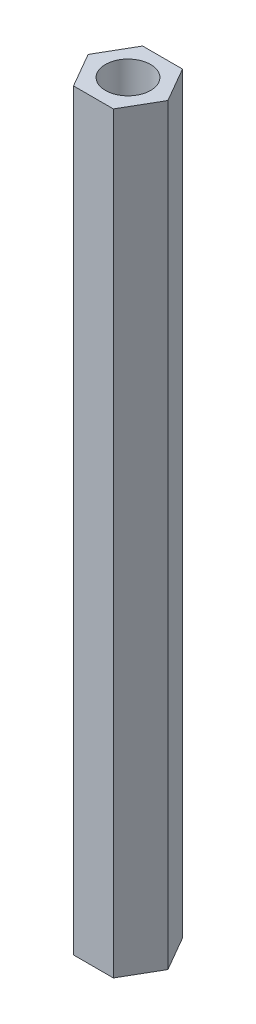
ISO-10303-21;
HEADER;
FILE_DESCRIPTION(('STEP AP214'),'2;1');
FILE_NAME('part.step','',(''),(''),'','','');
FILE_SCHEMA(('AUTOMOTIVE_DESIGN { 1 0 10303 214 1 1 1 1 }'));
ENDSEC;
DATA;
#1=APPLICATION_CONTEXT('core data for automotive mechanical design processes');
#2=APPLICATION_PROTOCOL_DEFINITION('international standard','automotive_design',2000,#1);
#3=PRODUCT_CONTEXT('',#1,'mechanical');
#4=PRODUCT('Part','Part','',(#3));
#5=PRODUCT_RELATED_PRODUCT_CATEGORY('part','',(#4));
#6=PRODUCT_DEFINITION_FORMATION('','',#4);
#7=PRODUCT_DEFINITION_CONTEXT('part definition',#1,'design');
#8=PRODUCT_DEFINITION('design','',#6,#7);
#9=PRODUCT_DEFINITION_SHAPE('','',#8);
#10=(LENGTH_UNIT() NAMED_UNIT(*) SI_UNIT(.MILLI.,.METRE.));
#11=(NAMED_UNIT(*) PLANE_ANGLE_UNIT() SI_UNIT($,.RADIAN.));
#12=(NAMED_UNIT(*) SI_UNIT($,.STERADIAN.) SOLID_ANGLE_UNIT());
#13=UNCERTAINTY_MEASURE_WITH_UNIT(LENGTH_MEASURE(1.E-05),#10,'distance_accuracy_value','');
#14=(GEOMETRIC_REPRESENTATION_CONTEXT(3) GLOBAL_UNCERTAINTY_ASSIGNED_CONTEXT((#13)) GLOBAL_UNIT_ASSIGNED_CONTEXT((#10,
#11,#12)) REPRESENTATION_CONTEXT('',''));
#15=CARTESIAN_POINT('',(0.,0.,0.));
#16=DIRECTION('',(0.,0.,1.));
#17=DIRECTION('',(1.,0.,0.));
#18=AXIS2_PLACEMENT_3D('',#15,#16,#17);
#19=CARTESIAN_POINT('',(1.32500000000001,50.,2.29496732002878));
#20=DIRECTION('',(-0.866025403784439,0.,-0.499999999999999));
#21=DIRECTION('',(-0.499999999999999,0.,0.866025403784439));
#22=AXIS2_PLACEMENT_3D('',#19,#20,#21);
#23=PLANE('',#22);
#24=DIRECTION('',(0.499999999999999,0.,-0.866025403784439));
#25=VECTOR('',#24,1.);
#26=CARTESIAN_POINT('',(1.32500000000001,0.,2.29496732002878));
#27=LINE('',#26,#25);
#28=CARTESIAN_POINT('',(1.32500000000001,0.,2.29496732002878));
#29=VERTEX_POINT('',#28);
#30=CARTESIAN_POINT('',(2.65000000000001,0.,0.));
#31=VERTEX_POINT('',#30);
#32=EDGE_CURVE('E123',#29,#31,#27,.T.);
#33=ORIENTED_EDGE('',*,*,#32,.T.);
#34=DIRECTION('',(0.,-1.,0.));
#35=VECTOR('',#34,1.);
#36=CARTESIAN_POINT('',(2.65000000000001,50.,0.));
#37=LINE('',#36,#35);
#38=CARTESIAN_POINT('',(2.65000000000001,50.,0.));
#39=VERTEX_POINT('',#38);
#40=EDGE_CURVE('E11',#39,#31,#37,.T.);
#41=ORIENTED_EDGE('',*,*,#40,.F.);
#42=DIRECTION('',(0.499999999999999,0.,-0.866025403784439));
#43=VECTOR('',#42,1.);
#44=CARTESIAN_POINT('',(1.32500000000001,50.,2.29496732002878));
#45=LINE('',#44,#43);
#46=CARTESIAN_POINT('',(1.32500000000001,50.,2.29496732002878));
#47=VERTEX_POINT('',#46);
#48=EDGE_CURVE('E134',#47,#39,#45,.T.);
#49=ORIENTED_EDGE('',*,*,#48,.F.);
#50=DIRECTION('',(0.,-1.,0.));
#51=VECTOR('',#50,1.);
#52=CARTESIAN_POINT('',(1.32500000000001,50.,2.29496732002878));
#53=LINE('',#52,#51);
#54=EDGE_CURVE('E119',#47,#29,#53,.T.);
#55=ORIENTED_EDGE('',*,*,#54,.T.);
#56=EDGE_LOOP('',(#33,#41,#49,#55));
#57=FACE_BOUND('',#56,.T.);
#58=ADVANCED_FACE('F39',(#57),#23,.F.);
#59=CARTESIAN_POINT('',(2.65000000000001,50.,0.));
#60=DIRECTION('',(-0.866025403784438,0.,0.500000000000001));
#61=DIRECTION('',(0.500000000000001,0.,0.866025403784438));
#62=AXIS2_PLACEMENT_3D('',#59,#60,#61);
#63=PLANE('',#62);
#64=DIRECTION('',(-0.500000000000001,0.,-0.866025403784438));
#65=VECTOR('',#64,1.);
#66=CARTESIAN_POINT('',(2.65000000000001,0.,0.));
#67=LINE('',#66,#65);
#68=CARTESIAN_POINT('',(1.325,0.,-2.29496732002879));
#69=VERTEX_POINT('',#68);
#70=EDGE_CURVE('E126',#31,#69,#67,.T.);
#71=ORIENTED_EDGE('',*,*,#70,.T.);
#72=DIRECTION('',(0.,-1.,0.));
#73=VECTOR('',#72,1.);
#74=CARTESIAN_POINT('',(1.325,50.,-2.29496732002879));
#75=LINE('',#74,#73);
#76=CARTESIAN_POINT('',(1.325,50.,-2.29496732002879));
#77=VERTEX_POINT('',#76);
#78=EDGE_CURVE('E47',#77,#69,#75,.T.);
#79=ORIENTED_EDGE('',*,*,#78,.F.);
#80=DIRECTION('',(-0.500000000000001,0.,-0.866025403784438));
#81=VECTOR('',#80,1.);
#82=CARTESIAN_POINT('',(2.65000000000001,50.,0.));
#83=LINE('',#82,#81);
#84=EDGE_CURVE('E92',#39,#77,#83,.T.);
#85=ORIENTED_EDGE('',*,*,#84,.F.);
#86=ORIENTED_EDGE('',*,*,#40,.T.);
#87=EDGE_LOOP('',(#71,#79,#85,#86));
#88=FACE_BOUND('',#87,.T.);
#89=ADVANCED_FACE('F159',(#88),#63,.F.);
#90=CARTESIAN_POINT('',(1.325,50.,-2.29496732002879));
#91=DIRECTION('',(0.,0.,1.));
#92=DIRECTION('',(1.,0.,0.));
#93=AXIS2_PLACEMENT_3D('',#90,#91,#92);
#94=PLANE('',#93);
#95=DIRECTION('',(-1.,0.,0.));
#96=VECTOR('',#95,1.);
#97=CARTESIAN_POINT('',(1.325,0.,-2.29496732002879));
#98=LINE('',#97,#96);
#99=CARTESIAN_POINT('',(-1.32500000000001,0.,-2.29496732002879));
#100=VERTEX_POINT('',#99);
#101=EDGE_CURVE('E129',#69,#100,#98,.T.);
#102=ORIENTED_EDGE('',*,*,#101,.T.);
#103=DIRECTION('',(0.,-1.,0.));
#104=VECTOR('',#103,1.);
#105=CARTESIAN_POINT('',(-1.32500000000001,50.,-2.29496732002879));
#106=LINE('',#105,#104);
#107=CARTESIAN_POINT('',(-1.32500000000001,50.,-2.29496732002879));
#108=VERTEX_POINT('',#107);
#109=EDGE_CURVE('E114',#108,#100,#106,.T.);
#110=ORIENTED_EDGE('',*,*,#109,.F.);
#111=DIRECTION('',(-1.,0.,0.));
#112=VECTOR('',#111,1.);
#113=CARTESIAN_POINT('',(1.325,50.,-2.29496732002879));
#114=LINE('',#113,#112);
#115=EDGE_CURVE('E105',#77,#108,#114,.T.);
#116=ORIENTED_EDGE('',*,*,#115,.F.);
#117=ORIENTED_EDGE('',*,*,#78,.T.);
#118=EDGE_LOOP('',(#102,#110,#116,#117));
#119=FACE_BOUND('',#118,.T.);
#120=ADVANCED_FACE('F140',(#119),#94,.F.);
#121=CARTESIAN_POINT('',(-1.32500000000001,50.,-2.29496732002879));
#122=DIRECTION('',(0.866025403784439,0.,0.5));
#123=DIRECTION('',(0.5,0.,-0.866025403784439));
#124=AXIS2_PLACEMENT_3D('',#121,#122,#123);
#125=PLANE('',#124);
#126=DIRECTION('',(-0.5,0.,0.866025403784439));
#127=VECTOR('',#126,1.);
#128=CARTESIAN_POINT('',(-1.32500000000001,0.,-2.29496732002879));
#129=LINE('',#128,#127);
#130=CARTESIAN_POINT('',(-2.65000000000002,0.,0.));
#131=VERTEX_POINT('',#130);
#132=EDGE_CURVE('E113',#100,#131,#129,.T.);
#133=ORIENTED_EDGE('',*,*,#132,.T.);
#134=DIRECTION('',(0.,-1.,0.));
#135=VECTOR('',#134,1.);
#136=CARTESIAN_POINT('',(-2.65000000000002,50.,0.));
#137=LINE('',#136,#135);
#138=CARTESIAN_POINT('',(-2.65000000000002,50.,0.));
#139=VERTEX_POINT('',#138);
#140=EDGE_CURVE('E110',#139,#131,#137,.T.);
#141=ORIENTED_EDGE('',*,*,#140,.F.);
#142=DIRECTION('',(-0.5,0.,0.866025403784439));
#143=VECTOR('',#142,1.);
#144=CARTESIAN_POINT('',(-1.32500000000001,50.,-2.29496732002879));
#145=LINE('',#144,#143);
#146=EDGE_CURVE('E99',#108,#139,#145,.T.);
#147=ORIENTED_EDGE('',*,*,#146,.F.);
#148=ORIENTED_EDGE('',*,*,#109,.T.);
#149=EDGE_LOOP('',(#133,#141,#147,#148));
#150=FACE_BOUND('',#149,.T.);
#151=ADVANCED_FACE('F111',(#150),#125,.F.);
#152=CARTESIAN_POINT('',(-2.65000000000002,50.,0.));
#153=DIRECTION('',(0.86602540378444,0.,-0.499999999999998));
#154=DIRECTION('',(-0.499999999999998,0.,-0.86602540378444));
#155=AXIS2_PLACEMENT_3D('',#152,#153,#154);
#156=PLANE('',#155);
#157=DIRECTION('',(0.499999999999998,0.,0.86602540378444));
#158=VECTOR('',#157,1.);
#159=CARTESIAN_POINT('',(-2.65000000000002,0.,0.));
#160=LINE('',#159,#158);
#161=CARTESIAN_POINT('',(-1.32500000000001,0.,2.29496732002878));
#162=VERTEX_POINT('',#161);
#163=EDGE_CURVE('E78',#131,#162,#160,.T.);
#164=ORIENTED_EDGE('',*,*,#163,.T.);
#165=DIRECTION('',(0.,-1.,0.));
#166=VECTOR('',#165,1.);
#167=CARTESIAN_POINT('',(-1.32500000000001,50.,2.29496732002878));
#168=LINE('',#167,#166);
#169=CARTESIAN_POINT('',(-1.32500000000001,50.,2.29496732002878));
#170=VERTEX_POINT('',#169);
#171=EDGE_CURVE('E115',#170,#162,#168,.T.);
#172=ORIENTED_EDGE('',*,*,#171,.F.);
#173=DIRECTION('',(0.499999999999998,0.,0.86602540378444));
#174=VECTOR('',#173,1.);
#175=CARTESIAN_POINT('',(-2.65000000000002,50.,0.));
#176=LINE('',#175,#174);
#177=EDGE_CURVE('E103',#139,#170,#176,.T.);
#178=ORIENTED_EDGE('',*,*,#177,.F.);
#179=ORIENTED_EDGE('',*,*,#140,.T.);
#180=EDGE_LOOP('',(#164,#172,#178,#179));
#181=FACE_BOUND('',#180,.T.);
#182=ADVANCED_FACE('F117',(#181),#156,.F.);
#183=CARTESIAN_POINT('',(-1.32500000000001,50.,2.29496732002878));
#184=DIRECTION('',(0.,0.,-1.));
#185=DIRECTION('',(-1.,0.,0.));
#186=AXIS2_PLACEMENT_3D('',#183,#184,#185);
#187=PLANE('',#186);
#188=DIRECTION('',(1.,0.,0.));
#189=VECTOR('',#188,1.);
#190=CARTESIAN_POINT('',(-1.32500000000001,0.,2.29496732002878));
#191=LINE('',#190,#189);
#192=EDGE_CURVE('E84',#162,#29,#191,.T.);
#193=ORIENTED_EDGE('',*,*,#192,.T.);
#194=ORIENTED_EDGE('',*,*,#54,.F.);
#195=DIRECTION('',(1.,0.,0.));
#196=VECTOR('',#195,1.);
#197=CARTESIAN_POINT('',(-1.32500000000001,50.,2.29496732002878));
#198=LINE('',#197,#196);
#199=EDGE_CURVE('E55',#170,#47,#198,.T.);
#200=ORIENTED_EDGE('',*,*,#199,.F.);
#201=ORIENTED_EDGE('',*,*,#171,.T.);
#202=EDGE_LOOP('',(#193,#194,#200,#201));
#203=FACE_BOUND('',#202,.T.);
#204=ADVANCED_FACE('F147',(#203),#187,.F.);
#205=CARTESIAN_POINT('',(0.,50.,0.));
#206=DIRECTION('',(0.,1.,0.));
#207=DIRECTION('',(0.,0.,1.));
#208=AXIS2_PLACEMENT_3D('',#205,#206,#207);
#209=PLANE('',#208);
#210=CARTESIAN_POINT('',(0.,50.,0.));
#211=DIRECTION('',(0.,1.,0.));
#212=DIRECTION('',(0.,0.,1.));
#213=AXIS2_PLACEMENT_3D('',#210,#211,#212);
#214=CIRCLE('',#213,1.5);
#215=CARTESIAN_POINT('',(0.,50.,1.5));
#216=VERTEX_POINT('',#215);
#217=EDGE_CURVE('E215',#216,#216,#214,.T.);
#218=ORIENTED_EDGE('',*,*,#217,.F.);
#219=EDGE_LOOP('',(#218));
#220=FACE_BOUND('',#219,.T.);
#221=ORIENTED_EDGE('',*,*,#48,.T.);
#222=ORIENTED_EDGE('',*,*,#84,.T.);
#223=ORIENTED_EDGE('',*,*,#115,.T.);
#224=ORIENTED_EDGE('',*,*,#146,.T.);
#225=ORIENTED_EDGE('',*,*,#177,.T.);
#226=ORIENTED_EDGE('',*,*,#199,.T.);
#227=EDGE_LOOP('',(#221,#222,#223,#224,#225,#226));
#228=FACE_BOUND('',#227,.T.);
#229=ADVANCED_FACE('F101',(#220,#228),#209,.T.);
#230=CARTESIAN_POINT('',(0.,0.,0.));
#231=DIRECTION('',(0.,1.,0.));
#232=DIRECTION('',(0.,0.,1.));
#233=AXIS2_PLACEMENT_3D('',#230,#231,#232);
#234=PLANE('',#233);
#235=CARTESIAN_POINT('',(0.,0.,0.));
#236=DIRECTION('',(0.,1.,0.));
#237=DIRECTION('',(0.,0.,1.));
#238=AXIS2_PLACEMENT_3D('',#235,#236,#237);
#239=CIRCLE('',#238,1.5);
#240=CARTESIAN_POINT('',(0.,0.,1.5));
#241=VERTEX_POINT('',#240);
#242=EDGE_CURVE('E127',#241,#241,#239,.T.);
#243=ORIENTED_EDGE('',*,*,#242,.T.);
#244=EDGE_LOOP('',(#243));
#245=FACE_BOUND('',#244,.T.);
#246=ORIENTED_EDGE('',*,*,#32,.F.);
#247=ORIENTED_EDGE('',*,*,#192,.F.);
#248=ORIENTED_EDGE('',*,*,#163,.F.);
#249=ORIENTED_EDGE('',*,*,#132,.F.);
#250=ORIENTED_EDGE('',*,*,#101,.F.);
#251=ORIENTED_EDGE('',*,*,#70,.F.);
#252=EDGE_LOOP('',(#246,#247,#248,#249,#250,#251));
#253=FACE_BOUND('',#252,.T.);
#254=ADVANCED_FACE('F143',(#245,#253),#234,.F.);
#255=CARTESIAN_POINT('',(0.,0.,0.));
#256=DIRECTION('',(0.,1.,0.));
#257=DIRECTION('',(0.,0.,1.));
#258=AXIS2_PLACEMENT_3D('',#255,#256,#257);
#259=CYLINDRICAL_SURFACE('',#258,1.5);
#260=ORIENTED_EDGE('',*,*,#242,.F.);
#261=EDGE_LOOP('',(#260));
#262=FACE_BOUND('',#261,.T.);
#263=ORIENTED_EDGE('',*,*,#217,.T.);
#264=EDGE_LOOP('',(#263));
#265=FACE_BOUND('',#264,.T.);
#266=ADVANCED_FACE('F198',(#262,#265),#259,.F.);
#267=CLOSED_SHELL('',(#58,#89,#120,#151,#182,#204,#229,#254,#266));
#268=MANIFOLD_SOLID_BREP('B2',#267);
#269=ADVANCED_BREP_SHAPE_REPRESENTATION('',(#18,#268),#14);
#270=SHAPE_DEFINITION_REPRESENTATION(#9,#269);
ENDSEC;
END-ISO-10303-21;
